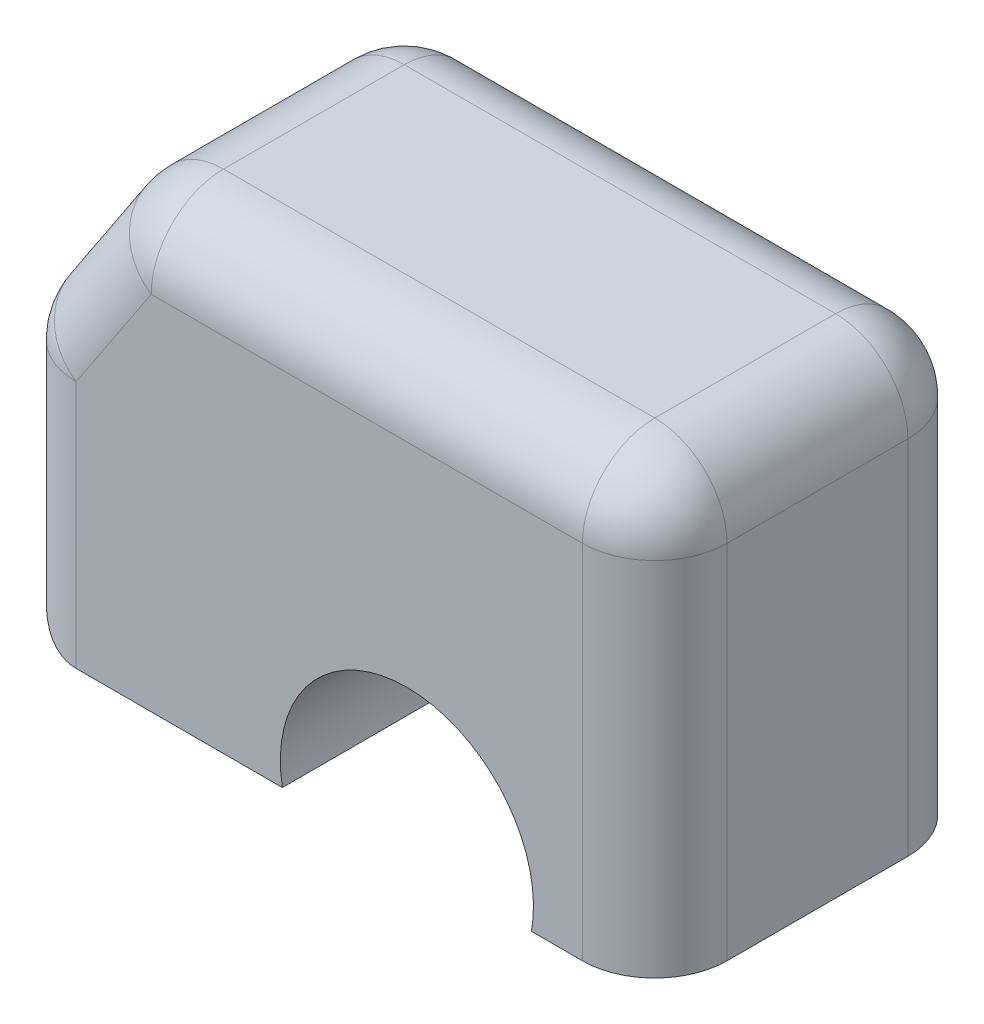
ISO-10303-21;
HEADER;
FILE_DESCRIPTION(('STEP AP214'),'2;1');
FILE_NAME('part.step','',(''),(''),'','','');
FILE_SCHEMA(('AUTOMOTIVE_DESIGN { 1 0 10303 214 1 1 1 1 }'));
ENDSEC;
DATA;
#1=APPLICATION_CONTEXT('core data for automotive mechanical design processes');
#2=APPLICATION_PROTOCOL_DEFINITION('international standard','automotive_design',2000,#1);
#3=PRODUCT_CONTEXT('',#1,'mechanical');
#4=PRODUCT('Part','Part','',(#3));
#5=PRODUCT_RELATED_PRODUCT_CATEGORY('part','',(#4));
#6=PRODUCT_DEFINITION_FORMATION('','',#4);
#7=PRODUCT_DEFINITION_CONTEXT('part definition',#1,'design');
#8=PRODUCT_DEFINITION('design','',#6,#7);
#9=PRODUCT_DEFINITION_SHAPE('','',#8);
#10=(LENGTH_UNIT() NAMED_UNIT(*) SI_UNIT(.MILLI.,.METRE.));
#11=(NAMED_UNIT(*) PLANE_ANGLE_UNIT() SI_UNIT($,.RADIAN.));
#12=(NAMED_UNIT(*) SI_UNIT($,.STERADIAN.) SOLID_ANGLE_UNIT());
#13=UNCERTAINTY_MEASURE_WITH_UNIT(LENGTH_MEASURE(1.E-05),#10,'distance_accuracy_value','');
#14=(GEOMETRIC_REPRESENTATION_CONTEXT(3) GLOBAL_UNCERTAINTY_ASSIGNED_CONTEXT((#13)) GLOBAL_UNIT_ASSIGNED_CONTEXT((#10,
#11,#12)) REPRESENTATION_CONTEXT('',''));
#15=CARTESIAN_POINT('',(0.,0.,0.));
#16=DIRECTION('',(0.,0.,1.));
#17=DIRECTION('',(1.,0.,0.));
#18=AXIS2_PLACEMENT_3D('',#15,#16,#17);
#19=CARTESIAN_POINT('',(58.0757632885705,-34.5077170209713,45.));
#20=DIRECTION('',(0.,1.,0.));
#21=DIRECTION('',(0.,0.,1.));
#22=AXIS2_PLACEMENT_3D('',#19,#20,#21);
#23=PLANE('',#22);
#24=DIRECTION('',(1.,0.,0.));
#25=VECTOR('',#24,1.);
#26=CARTESIAN_POINT('',(58.0757632885705,-34.5077170209713,0.));
#27=LINE('',#26,#25);
#28=CARTESIAN_POINT('',(58.0757632885705,-34.5077170209713,0.));
#29=VERTEX_POINT('',#28);
#30=CARTESIAN_POINT('',(65.1273648648649,-34.5077170209713,0.));
#31=VERTEX_POINT('',#30);
#32=EDGE_CURVE('E185',#29,#31,#27,.T.);
#33=ORIENTED_EDGE('',*,*,#32,.T.);
#34=CARTESIAN_POINT('',(65.1273648648649,-34.5077170209713,10.));
#35=DIRECTION('',(0.,1.,0.));
#36=DIRECTION('',(0.,0.,1.));
#37=AXIS2_PLACEMENT_3D('',#34,#35,#36);
#38=CIRCLE('',#37,10.);
#39=CARTESIAN_POINT('',(75.1273648648649,-34.5077170209713,10.));
#40=VERTEX_POINT('',#39);
#41=EDGE_CURVE('E303',#31,#40,#38,.F.);
#42=ORIENTED_EDGE('',*,*,#41,.T.);
#43=DIRECTION('',(0.,0.,-1.));
#44=VECTOR('',#43,1.);
#45=CARTESIAN_POINT('',(75.1273648648649,-34.5077170209713,45.));
#46=LINE('',#45,#44);
#47=CARTESIAN_POINT('',(75.1273648648649,-34.5077170209713,35.));
#48=VERTEX_POINT('',#47);
#49=EDGE_CURVE('E173',#48,#40,#46,.T.);
#50=ORIENTED_EDGE('',*,*,#49,.F.);
#51=CARTESIAN_POINT('',(65.1273648648649,-34.5077170209713,35.));
#52=DIRECTION('',(0.,1.,0.));
#53=DIRECTION('',(0.,0.,1.));
#54=AXIS2_PLACEMENT_3D('',#51,#52,#53);
#55=CIRCLE('',#54,10.);
#56=CARTESIAN_POINT('',(65.1273648648649,-34.5077170209713,45.));
#57=VERTEX_POINT('',#56);
#58=EDGE_CURVE('E300',#48,#57,#55,.F.);
#59=ORIENTED_EDGE('',*,*,#58,.T.);
#60=DIRECTION('',(1.,0.,0.));
#61=VECTOR('',#60,1.);
#62=CARTESIAN_POINT('',(58.0757632885705,-34.5077170209713,45.));
#63=LINE('',#62,#61);
#64=CARTESIAN_POINT('',(58.0757632885705,-34.5077170209713,45.));
#65=VERTEX_POINT('',#64);
#66=EDGE_CURVE('E163',#65,#57,#63,.T.);
#67=ORIENTED_EDGE('',*,*,#66,.F.);
#68=DIRECTION('',(0.,0.,-1.));
#69=VECTOR('',#68,1.);
#70=CARTESIAN_POINT('',(58.0757632885705,-34.5077170209713,45.));
#71=LINE('',#70,#69);
#72=EDGE_CURVE('E174',#65,#29,#71,.T.);
#73=ORIENTED_EDGE('',*,*,#72,.T.);
#74=EDGE_LOOP('',(#33,#42,#50,#59,#67,#73));
#75=FACE_BOUND('',#74,.T.);
#76=ADVANCED_FACE('F43',(#75),#23,.F.);
#77=CARTESIAN_POINT('',(75.1273648648649,25.4922829790286,45.));
#78=DIRECTION('',(-1.,0.,0.));
#79=DIRECTION('',(0.,0.,1.));
#80=AXIS2_PLACEMENT_3D('',#77,#78,#79);
#81=PLANE('',#80);
#82=ORIENTED_EDGE('',*,*,#49,.T.);
#83=DIRECTION('',(0.,1.,0.));
#84=VECTOR('',#83,1.);
#85=CARTESIAN_POINT('',(75.1273648648649,25.4922829790286,10.));
#86=LINE('',#85,#84);
#87=CARTESIAN_POINT('',(75.1273648648649,15.4922829790286,10.));
#88=VERTEX_POINT('',#87);
#89=EDGE_CURVE('E291',#40,#88,#86,.T.);
#90=ORIENTED_EDGE('',*,*,#89,.T.);
#91=DIRECTION('',(0.,0.,-1.));
#92=VECTOR('',#91,1.);
#93=CARTESIAN_POINT('',(75.1273648648649,15.4922829790286,45.));
#94=LINE('',#93,#92);
#95=CARTESIAN_POINT('',(75.1273648648649,15.4922829790286,35.));
#96=VERTEX_POINT('',#95);
#97=EDGE_CURVE('E285',#88,#96,#94,.F.);
#98=ORIENTED_EDGE('',*,*,#97,.T.);
#99=DIRECTION('',(0.,1.,0.));
#100=VECTOR('',#99,1.);
#101=CARTESIAN_POINT('',(75.1273648648649,-34.5077170209713,35.));
#102=LINE('',#101,#100);
#103=EDGE_CURVE('E288',#96,#48,#102,.F.);
#104=ORIENTED_EDGE('',*,*,#103,.T.);
#105=EDGE_LOOP('',(#82,#90,#98,#104));
#106=FACE_BOUND('',#105,.T.);
#107=ADVANCED_FACE('F412',(#106),#81,.F.);
#108=CARTESIAN_POINT('',(0.127364864864879,25.4922829790286,45.));
#109=DIRECTION('',(0.,-1.,0.));
#110=DIRECTION('',(1.,0.,0.));
#111=AXIS2_PLACEMENT_3D('',#108,#109,#110);
#112=PLANE('',#111);
#113=DIRECTION('',(0.,0.,-1.));
#114=VECTOR('',#113,1.);
#115=CARTESIAN_POINT('',(65.1273648648649,25.4922829790286,45.));
#116=LINE('',#115,#114);
#117=CARTESIAN_POINT('',(65.1273648648649,25.4922829790286,35.));
#118=VERTEX_POINT('',#117);
#119=CARTESIAN_POINT('',(65.1273648648649,25.4922829790286,10.));
#120=VERTEX_POINT('',#119);
#121=EDGE_CURVE('E53',#118,#120,#116,.T.);
#122=ORIENTED_EDGE('',*,*,#121,.T.);
#123=DIRECTION('',(-1.,0.,0.));
#124=VECTOR('',#123,1.);
#125=CARTESIAN_POINT('',(0.127364864864879,25.4922829790286,10.));
#126=LINE('',#125,#124);
#127=CARTESIAN_POINT('',(5.49799733045643,25.4922829790286,10.));
#128=VERTEX_POINT('',#127);
#129=EDGE_CURVE('E11',#120,#128,#126,.T.);
#130=ORIENTED_EDGE('',*,*,#129,.T.);
#131=DIRECTION('',(0.,0.,-1.));
#132=VECTOR('',#131,1.);
#133=CARTESIAN_POINT('',(5.49799733045643,25.4922829790286,45.));
#134=LINE('',#133,#132);
#135=CARTESIAN_POINT('',(5.49799733045643,25.4922829790286,35.));
#136=VERTEX_POINT('',#135);
#137=EDGE_CURVE('E241',#128,#136,#134,.F.);
#138=ORIENTED_EDGE('',*,*,#137,.T.);
#139=DIRECTION('',(-1.,0.,0.));
#140=VECTOR('',#139,1.);
#141=CARTESIAN_POINT('',(75.1273648648649,25.4922829790286,35.));
#142=LINE('',#141,#140);
#143=EDGE_CURVE('E64',#136,#118,#142,.F.);
#144=ORIENTED_EDGE('',*,*,#143,.T.);
#145=EDGE_LOOP('',(#122,#130,#138,#144));
#146=FACE_BOUND('',#145,.T.);
#147=ADVANCED_FACE('F418',(#146),#112,.F.);
#148=CARTESIAN_POINT('',(-14.8726351351351,2.84931836452923,45.));
#149=DIRECTION('',(0.833666334329219,-0.552268451938079,0.));
#150=DIRECTION('',(0.552268451938079,0.833666334329219,0.));
#151=AXIS2_PLACEMENT_3D('',#148,#149,#150);
#152=PLANE('',#151);
#153=DIRECTION('',(-0.552268451938079,-0.833666334329219,0.));
#154=VECTOR('',#153,1.);
#155=CARTESIAN_POINT('',(-14.8726351351351,2.84931836452923,10.));
#156=LINE('',#155,#154);
#157=CARTESIAN_POINT('',(-2.83866601283576,21.0149674984094,10.));
#158=VERTEX_POINT('',#157);
#159=CARTESIAN_POINT('',(-13.2092984784273,5.3601765685182,10.));
#160=VERTEX_POINT('',#159);
#161=EDGE_CURVE('E230',#158,#160,#156,.T.);
#162=ORIENTED_EDGE('',*,*,#161,.T.);
#163=DIRECTION('',(0.,0.,-1.));
#164=VECTOR('',#163,1.);
#165=CARTESIAN_POINT('',(-13.2092984784273,5.3601765685182,45.));
#166=LINE('',#165,#164);
#167=CARTESIAN_POINT('',(-13.2092984784273,5.3601765685182,35.));
#168=VERTEX_POINT('',#167);
#169=EDGE_CURVE('E237',#160,#168,#166,.F.);
#170=ORIENTED_EDGE('',*,*,#169,.T.);
#171=DIRECTION('',(-0.552268451938079,-0.833666334329219,0.));
#172=VECTOR('',#171,1.);
#173=CARTESIAN_POINT('',(0.127364864864878,25.4922829790286,35.));
#174=LINE('',#173,#172);
#175=CARTESIAN_POINT('',(-2.83866601283576,21.0149674984094,35.));
#176=VERTEX_POINT('',#175);
#177=EDGE_CURVE('E233',#168,#176,#174,.F.);
#178=ORIENTED_EDGE('',*,*,#177,.T.);
#179=DIRECTION('',(0.,0.,-1.));
#180=VECTOR('',#179,1.);
#181=CARTESIAN_POINT('',(-2.83866601283576,21.0149674984094,45.));
#182=LINE('',#181,#180);
#183=EDGE_CURVE('E226',#176,#158,#182,.T.);
#184=ORIENTED_EDGE('',*,*,#183,.T.);
#185=EDGE_LOOP('',(#162,#170,#178,#184));
#186=FACE_BOUND('',#185,.T.);
#187=ADVANCED_FACE('F360',(#186),#152,.F.);
#188=CARTESIAN_POINT('',(-14.8726351351351,2.84931836452923,45.));
#189=DIRECTION('',(1.,0.,0.));
#190=DIRECTION('',(0.,0.,-1.));
#191=AXIS2_PLACEMENT_3D('',#188,#189,#190);
#192=PLANE('',#191);
#193=DIRECTION('',(0.,-1.,0.));
#194=VECTOR('',#193,1.);
#195=CARTESIAN_POINT('',(-14.8726351351351,2.84931836452923,10.));
#196=LINE('',#195,#194);
#197=CARTESIAN_POINT('',(-14.8726351351351,-0.162507950862588,10.));
#198=VERTEX_POINT('',#197);
#199=CARTESIAN_POINT('',(-14.8726351351351,-24.5077170209714,10.));
#200=VERTEX_POINT('',#199);
#201=EDGE_CURVE('E204',#198,#200,#196,.T.);
#202=ORIENTED_EDGE('',*,*,#201,.T.);
#203=DIRECTION('',(0.,0.,-1.));
#204=VECTOR('',#203,1.);
#205=CARTESIAN_POINT('',(-14.8726351351351,-24.5077170209714,45.));
#206=LINE('',#205,#204);
#207=CARTESIAN_POINT('',(-14.8726351351351,-24.5077170209714,35.));
#208=VERTEX_POINT('',#207);
#209=EDGE_CURVE('E210',#200,#208,#206,.F.);
#210=ORIENTED_EDGE('',*,*,#209,.T.);
#211=DIRECTION('',(0.,-1.,0.));
#212=VECTOR('',#211,1.);
#213=CARTESIAN_POINT('',(-14.8726351351351,2.84931836452923,35.));
#214=LINE('',#213,#212);
#215=CARTESIAN_POINT('',(-14.8726351351351,-0.162507950862588,35.));
#216=VERTEX_POINT('',#215);
#217=EDGE_CURVE('E207',#208,#216,#214,.F.);
#218=ORIENTED_EDGE('',*,*,#217,.T.);
#219=DIRECTION('',(0.,0.,-1.));
#220=VECTOR('',#219,1.);
#221=CARTESIAN_POINT('',(-14.8726351351351,-0.162507950862588,45.));
#222=LINE('',#221,#220);
#223=EDGE_CURVE('E201',#216,#198,#222,.T.);
#224=ORIENTED_EDGE('',*,*,#223,.T.);
#225=EDGE_LOOP('',(#202,#210,#218,#224));
#226=FACE_BOUND('',#225,.T.);
#227=ADVANCED_FACE('F391',(#226),#192,.F.);
#228=CARTESIAN_POINT('',(-14.8726351351351,-34.5077170209713,45.));
#229=DIRECTION('',(0.,1.,0.));
#230=DIRECTION('',(0.,0.,1.));
#231=AXIS2_PLACEMENT_3D('',#228,#229,#230);
#232=PLANE('',#231);
#233=DIRECTION('',(1.,0.,0.));
#234=VECTOR('',#233,1.);
#235=CARTESIAN_POINT('',(-14.8726351351351,-34.5077170209713,45.));
#236=LINE('',#235,#234);
#237=CARTESIAN_POINT('',(-4.87263513513513,-34.5077170209713,45.));
#238=VERTEX_POINT('',#237);
#239=CARTESIAN_POINT('',(23.6375119916014,-34.5077170209713,45.));
#240=VERTEX_POINT('',#239);
#241=EDGE_CURVE('E150',#238,#240,#236,.T.);
#242=ORIENTED_EDGE('',*,*,#241,.F.);
#243=DIRECTION('',(0.,0.,-1.));
#244=VECTOR('',#243,1.);
#245=CARTESIAN_POINT('',(-4.87263513513512,-34.5077170209713,45.));
#246=LINE('',#245,#244);
#247=CARTESIAN_POINT('',(-4.87263513513512,-34.5077170209713,0.));
#248=VERTEX_POINT('',#247);
#249=EDGE_CURVE('E198',#238,#248,#246,.T.);
#250=ORIENTED_EDGE('',*,*,#249,.T.);
#251=DIRECTION('',(1.,0.,0.));
#252=VECTOR('',#251,1.);
#253=CARTESIAN_POINT('',(-14.8726351351351,-34.5077170209713,0.));
#254=LINE('',#253,#252);
#255=CARTESIAN_POINT('',(23.6375119916014,-34.5077170209713,0.));
#256=VERTEX_POINT('',#255);
#257=EDGE_CURVE('E169',#248,#256,#254,.T.);
#258=ORIENTED_EDGE('',*,*,#257,.T.);
#259=DIRECTION('',(0.,0.,-1.));
#260=VECTOR('',#259,1.);
#261=CARTESIAN_POINT('',(23.6375119916014,-34.5077170209713,45.));
#262=LINE('',#261,#260);
#263=EDGE_CURVE('E166',#240,#256,#262,.T.);
#264=ORIENTED_EDGE('',*,*,#263,.F.);
#265=EDGE_LOOP('',(#242,#250,#258,#264));
#266=FACE_BOUND('',#265,.T.);
#267=ADVANCED_FACE('F167',(#266),#232,.F.);
#268=CARTESIAN_POINT('',(40.856637640086,-31.3849439101448,45.));
#269=DIRECTION('',(0.,0.,-1.));
#270=DIRECTION('',(-1.,0.,0.));
#271=AXIS2_PLACEMENT_3D('',#268,#269,#270);
#272=CYLINDRICAL_SURFACE('',#271,17.5);
#273=CARTESIAN_POINT('',(40.856637640086,-31.3849439101448,0.));
#274=DIRECTION('',(0.,0.,-1.));
#275=DIRECTION('',(1.,0.,0.));
#276=AXIS2_PLACEMENT_3D('',#273,#274,#275);
#277=CIRCLE('',#276,17.5);
#278=EDGE_CURVE('E192',#256,#29,#277,.T.);
#279=ORIENTED_EDGE('',*,*,#278,.T.);
#280=ORIENTED_EDGE('',*,*,#72,.F.);
#281=CARTESIAN_POINT('',(40.856637640086,-31.3849439101448,45.));
#282=DIRECTION('',(0.,0.,-1.));
#283=DIRECTION('',(1.,0.,0.));
#284=AXIS2_PLACEMENT_3D('',#281,#282,#283);
#285=CIRCLE('',#284,17.5);
#286=EDGE_CURVE('E155',#240,#65,#285,.T.);
#287=ORIENTED_EDGE('',*,*,#286,.F.);
#288=ORIENTED_EDGE('',*,*,#263,.T.);
#289=EDGE_LOOP('',(#279,#280,#287,#288));
#290=FACE_BOUND('',#289,.T.);
#291=ADVANCED_FACE('F176',(#290),#272,.F.);
#292=CARTESIAN_POINT('',(40.856637640086,-31.3849439101448,45.));
#293=DIRECTION('',(0.,0.,1.));
#294=DIRECTION('',(1.,0.,0.));
#295=AXIS2_PLACEMENT_3D('',#292,#293,#294);
#296=PLANE('',#295);
#297=ORIENTED_EDGE('',*,*,#66,.T.);
#298=DIRECTION('',(0.,1.,0.));
#299=VECTOR('',#298,1.);
#300=CARTESIAN_POINT('',(65.1273648648649,25.4922829790286,45.));
#301=LINE('',#300,#299);
#302=CARTESIAN_POINT('',(65.1273648648649,15.4922829790286,45.));
#303=VERTEX_POINT('',#302);
#304=EDGE_CURVE('E309',#57,#303,#301,.T.);
#305=ORIENTED_EDGE('',*,*,#304,.T.);
#306=DIRECTION('',(-1.,0.,0.));
#307=VECTOR('',#306,1.);
#308=CARTESIAN_POINT('',(12.1225715659321,15.4922829790286,45.));
#309=LINE('',#308,#307);
#310=CARTESIAN_POINT('',(5.49799733045644,15.4922829790286,45.));
#311=VERTEX_POINT('',#310);
#312=EDGE_CURVE('E306',#303,#311,#309,.T.);
#313=ORIENTED_EDGE('',*,*,#312,.T.);
#314=DIRECTION('',(-0.552268451938079,-0.833666334329219,0.));
#315=VECTOR('',#314,1.);
#316=CARTESIAN_POINT('',(-6.53597179184292,-2.67336615485156,45.));
#317=LINE('',#316,#315);
#318=CARTESIAN_POINT('',(-4.87263513513513,-0.162507950862605,45.));
#319=VERTEX_POINT('',#318);
#320=EDGE_CURVE('E214',#311,#319,#317,.T.);
#321=ORIENTED_EDGE('',*,*,#320,.T.);
#322=DIRECTION('',(0.,-1.,0.));
#323=VECTOR('',#322,1.);
#324=CARTESIAN_POINT('',(-4.87263513513513,-34.5077170209713,45.));
#325=LINE('',#324,#323);
#326=EDGE_CURVE('E158',#319,#238,#325,.T.);
#327=ORIENTED_EDGE('',*,*,#326,.T.);
#328=ORIENTED_EDGE('',*,*,#241,.T.);
#329=ORIENTED_EDGE('',*,*,#286,.T.);
#330=EDGE_LOOP('',(#297,#305,#313,#321,#327,#328,#329));
#331=FACE_BOUND('',#330,.T.);
#332=ADVANCED_FACE('F153',(#331),#296,.T.);
#333=CARTESIAN_POINT('',(40.856637640086,-31.3849439101448,0.));
#334=DIRECTION('',(0.,0.,1.));
#335=DIRECTION('',(1.,0.,0.));
#336=AXIS2_PLACEMENT_3D('',#333,#334,#335);
#337=PLANE('',#336);
#338=DIRECTION('',(-1.,0.,0.));
#339=VECTOR('',#338,1.);
#340=CARTESIAN_POINT('',(40.856637640086,15.4922829790286,0.));
#341=LINE('',#340,#339);
#342=CARTESIAN_POINT('',(5.49799733045644,15.4922829790286,0.));
#343=VERTEX_POINT('',#342);
#344=CARTESIAN_POINT('',(65.1273648648649,15.4922829790286,0.));
#345=VERTEX_POINT('',#344);
#346=EDGE_CURVE('E294',#343,#345,#341,.F.);
#347=ORIENTED_EDGE('',*,*,#346,.T.);
#348=DIRECTION('',(0.,1.,0.));
#349=VECTOR('',#348,1.);
#350=CARTESIAN_POINT('',(65.1273648648649,-31.3849439101448,0.));
#351=LINE('',#350,#349);
#352=EDGE_CURVE('E297',#345,#31,#351,.F.);
#353=ORIENTED_EDGE('',*,*,#352,.T.);
#354=ORIENTED_EDGE('',*,*,#32,.F.);
#355=ORIENTED_EDGE('',*,*,#278,.F.);
#356=ORIENTED_EDGE('',*,*,#257,.F.);
#357=DIRECTION('',(0.,-1.,0.));
#358=VECTOR('',#357,1.);
#359=CARTESIAN_POINT('',(-4.87263513513513,-31.3849439101448,0.));
#360=LINE('',#359,#358);
#361=CARTESIAN_POINT('',(-4.87263513513512,-0.162507950862584,0.));
#362=VERTEX_POINT('',#361);
#363=EDGE_CURVE('E223',#248,#362,#360,.F.);
#364=ORIENTED_EDGE('',*,*,#363,.T.);
#365=DIRECTION('',(-0.552268451938079,-0.833666334329219,0.));
#366=VECTOR('',#365,1.);
#367=CARTESIAN_POINT('',(-5.30023398272832,-0.807981655879496,0.));
#368=LINE('',#367,#366);
#369=EDGE_CURVE('E219',#362,#343,#368,.F.);
#370=ORIENTED_EDGE('',*,*,#369,.T.);
#371=EDGE_LOOP('',(#347,#353,#354,#355,#356,#364,#370));
#372=FACE_BOUND('',#371,.T.);
#373=ADVANCED_FACE('F377',(#372),#337,.F.);
#374=CARTESIAN_POINT('',(5.49799733045643,15.4922829790286,45.));
#375=DIRECTION('',(0.,0.,-1.));
#376=DIRECTION('',(-1.,0.,0.));
#377=AXIS2_PLACEMENT_3D('',#374,#375,#376);
#378=CYLINDRICAL_SURFACE('',#377,10.);
#379=ORIENTED_EDGE('',*,*,#137,.F.);
#380=CARTESIAN_POINT('',(5.49799733045643,15.4922829790286,10.));
#381=DIRECTION('',(0.,0.,-1.));
#382=DIRECTION('',(-1.,0.,0.));
#383=AXIS2_PLACEMENT_3D('',#380,#381,#382);
#384=CIRCLE('',#383,10.);
#385=EDGE_CURVE('E279',#128,#158,#384,.F.);
#386=ORIENTED_EDGE('',*,*,#385,.T.);
#387=ORIENTED_EDGE('',*,*,#183,.F.);
#388=CARTESIAN_POINT('',(5.49799733045643,15.4922829790286,35.));
#389=DIRECTION('',(0.,0.,-1.));
#390=DIRECTION('',(-1.,0.,0.));
#391=AXIS2_PLACEMENT_3D('',#388,#389,#390);
#392=CIRCLE('',#391,10.);
#393=EDGE_CURVE('E276',#176,#136,#392,.T.);
#394=ORIENTED_EDGE('',*,*,#393,.T.);
#395=EDGE_LOOP('',(#379,#386,#387,#394));
#396=FACE_BOUND('',#395,.T.);
#397=ADVANCED_FACE('F365',(#396),#378,.T.);
#398=CARTESIAN_POINT('',(-5.30023398272832,-0.807981655879496,35.));
#399=DIRECTION('',(0.552268451938079,0.833666334329219,0.));
#400=DIRECTION('',(-0.833666334329219,0.552268451938079,0.));
#401=AXIS2_PLACEMENT_3D('',#398,#399,#400);
#402=CYLINDRICAL_SURFACE('',#401,10.);
#403=ORIENTED_EDGE('',*,*,#320,.F.);
#404=CARTESIAN_POINT('',(5.49799733045644,15.4922829790286,35.));
#405=DIRECTION('',(0.552268451938079,0.833666334329219,0.));
#406=DIRECTION('',(-0.833666334329219,0.552268451938079,0.));
#407=AXIS2_PLACEMENT_3D('',#404,#405,#406);
#408=CIRCLE('',#407,10.);
#409=EDGE_CURVE('E282',#311,#176,#408,.F.);
#410=ORIENTED_EDGE('',*,*,#409,.T.);
#411=ORIENTED_EDGE('',*,*,#177,.F.);
#412=CARTESIAN_POINT('',(-4.87263513513513,-0.162507950862605,35.));
#413=DIRECTION('',(-0.55226845193808,-0.833666334329218,0.));
#414=DIRECTION('',(0.833666334329219,-0.55226845193808,0.));
#415=AXIS2_PLACEMENT_3D('',#412,#413,#414);
#416=CIRCLE('',#415,10.);
#417=EDGE_CURVE('E267',#319,#168,#416,.T.);
#418=ORIENTED_EDGE('',*,*,#417,.F.);
#419=EDGE_LOOP('',(#403,#410,#411,#418));
#420=FACE_BOUND('',#419,.T.);
#421=ADVANCED_FACE('F356',(#420),#402,.T.);
#422=CARTESIAN_POINT('',(-6.53597179184293,-2.67336615485156,10.));
#423=DIRECTION('',(-0.552268451938079,-0.833666334329219,0.));
#424=DIRECTION('',(0.833666334329219,-0.552268451938079,0.));
#425=AXIS2_PLACEMENT_3D('',#422,#423,#424);
#426=CYLINDRICAL_SURFACE('',#425,10.);
#427=ORIENTED_EDGE('',*,*,#161,.F.);
#428=CARTESIAN_POINT('',(5.49799733045644,15.4922829790286,10.));
#429=DIRECTION('',(-0.552268451938079,-0.833666334329219,0.));
#430=DIRECTION('',(0.833666334329219,-0.552268451938079,0.));
#431=AXIS2_PLACEMENT_3D('',#428,#429,#430);
#432=CIRCLE('',#431,10.);
#433=EDGE_CURVE('E244',#158,#343,#432,.T.);
#434=ORIENTED_EDGE('',*,*,#433,.T.);
#435=ORIENTED_EDGE('',*,*,#369,.F.);
#436=CARTESIAN_POINT('',(-4.87263513513512,-0.162507950862588,10.));
#437=DIRECTION('',(-0.552268451938079,-0.833666334329219,0.));
#438=DIRECTION('',(0.833666334329219,-0.552268451938079,0.));
#439=AXIS2_PLACEMENT_3D('',#436,#437,#438);
#440=CIRCLE('',#439,10.);
#441=EDGE_CURVE('E263',#160,#362,#440,.T.);
#442=ORIENTED_EDGE('',*,*,#441,.F.);
#443=EDGE_LOOP('',(#427,#434,#435,#442));
#444=FACE_BOUND('',#443,.T.);
#445=ADVANCED_FACE('F374',(#444),#426,.T.);
#446=CARTESIAN_POINT('',(-4.87263513513512,-0.162507950862588,45.));
#447=DIRECTION('',(0.,0.,-1.));
#448=DIRECTION('',(-1.,0.,0.));
#449=AXIS2_PLACEMENT_3D('',#446,#447,#448);
#450=CYLINDRICAL_SURFACE('',#449,10.);
#451=CARTESIAN_POINT('',(-4.87263513513512,-0.162507950862588,35.));
#452=DIRECTION('',(0.,0.,1.));
#453=DIRECTION('',(1.,0.,0.));
#454=AXIS2_PLACEMENT_3D('',#451,#452,#453);
#455=CIRCLE('',#454,10.);
#456=EDGE_CURVE('E189',#168,#216,#455,.T.);
#457=ORIENTED_EDGE('',*,*,#456,.F.);
#458=ORIENTED_EDGE('',*,*,#169,.F.);
#459=CARTESIAN_POINT('',(-4.87263513513512,-0.162507950862588,10.));
#460=DIRECTION('',(0.,0.,-1.));
#461=DIRECTION('',(-1.,0.,0.));
#462=AXIS2_PLACEMENT_3D('',#459,#460,#461);
#463=CIRCLE('',#462,10.);
#464=EDGE_CURVE('E259',#198,#160,#463,.T.);
#465=ORIENTED_EDGE('',*,*,#464,.F.);
#466=ORIENTED_EDGE('',*,*,#223,.F.);
#467=EDGE_LOOP('',(#457,#458,#465,#466));
#468=FACE_BOUND('',#467,.T.);
#469=ADVANCED_FACE('F396',(#468),#450,.T.);
#470=CARTESIAN_POINT('',(-4.87263513513512,-0.162507950862587,35.));
#471=DIRECTION('',(0.,0.,1.));
#472=DIRECTION('',(1.,0.,0.));
#473=AXIS2_PLACEMENT_3D('',#470,#471,#472);
#474=SPHERICAL_SURFACE('',#473,10.);
#475=ORIENTED_EDGE('',*,*,#417,.T.);
#476=ORIENTED_EDGE('',*,*,#456,.T.);
#477=CARTESIAN_POINT('',(-4.87263513513512,-0.162507950862588,35.));
#478=DIRECTION('',(0.,1.,0.));
#479=DIRECTION('',(0.,0.,1.));
#480=AXIS2_PLACEMENT_3D('',#477,#478,#479);
#481=CIRCLE('',#480,10.);
#482=EDGE_CURVE('E255',#319,#216,#481,.F.);
#483=ORIENTED_EDGE('',*,*,#482,.F.);
#484=EDGE_LOOP('',(#475,#476,#483));
#485=FACE_BOUND('',#484,.T.);
#486=ADVANCED_FACE('F401',(#485),#474,.T.);
#487=CARTESIAN_POINT('',(-4.87263513513512,-0.162507950862587,10.));
#488=DIRECTION('',(0.,0.,1.));
#489=DIRECTION('',(1.,0.,0.));
#490=AXIS2_PLACEMENT_3D('',#487,#488,#489);
#491=SPHERICAL_SURFACE('',#490,10.);
#492=ORIENTED_EDGE('',*,*,#464,.T.);
#493=ORIENTED_EDGE('',*,*,#441,.T.);
#494=CARTESIAN_POINT('',(-4.87263513513512,-0.162507950862584,10.));
#495=DIRECTION('',(0.,1.,0.));
#496=DIRECTION('',(-1.,0.,0.));
#497=AXIS2_PLACEMENT_3D('',#494,#495,#496);
#498=CIRCLE('',#497,10.);
#499=EDGE_CURVE('E251',#198,#362,#498,.F.);
#500=ORIENTED_EDGE('',*,*,#499,.F.);
#501=EDGE_LOOP('',(#492,#493,#500));
#502=FACE_BOUND('',#501,.T.);
#503=ADVANCED_FACE('F398',(#502),#491,.T.);
#504=CARTESIAN_POINT('',(-4.87263513513513,-31.3849439101448,35.));
#505=DIRECTION('',(0.,1.,0.));
#506=DIRECTION('',(0.,0.,1.));
#507=AXIS2_PLACEMENT_3D('',#504,#505,#506);
#508=CYLINDRICAL_SURFACE('',#507,10.);
#509=ORIENTED_EDGE('',*,*,#482,.T.);
#510=ORIENTED_EDGE('',*,*,#217,.F.);
#511=CARTESIAN_POINT('',(-4.87263513513512,-24.5077170209714,35.));
#512=DIRECTION('',(0.,0.707106781186547,0.707106781186547));
#513=DIRECTION('',(0.,0.707106781186547,-0.707106781186547));
#514=AXIS2_PLACEMENT_3D('',#511,#512,#513);
#515=ELLIPSE('',#514,14.1421356237309,10.);
#516=EDGE_CURVE('E248',#238,#208,#515,.F.);
#517=ORIENTED_EDGE('',*,*,#516,.F.);
#518=ORIENTED_EDGE('',*,*,#326,.F.);
#519=EDGE_LOOP('',(#509,#510,#517,#518));
#520=FACE_BOUND('',#519,.T.);
#521=ADVANCED_FACE('F400',(#520),#508,.T.);
#522=CARTESIAN_POINT('',(-4.87263513513512,2.84931836452923,10.));
#523=DIRECTION('',(0.,-1.,0.));
#524=DIRECTION('',(0.,0.,-1.));
#525=AXIS2_PLACEMENT_3D('',#522,#523,#524);
#526=CYLINDRICAL_SURFACE('',#525,10.);
#527=ORIENTED_EDGE('',*,*,#499,.T.);
#528=ORIENTED_EDGE('',*,*,#363,.F.);
#529=CARTESIAN_POINT('',(-4.87263513513512,-24.5077170209714,10.));
#530=DIRECTION('',(0.,-0.707106781186547,0.707106781186547));
#531=DIRECTION('',(0.,-0.707106781186547,-0.707106781186547));
#532=AXIS2_PLACEMENT_3D('',#529,#530,#531);
#533=ELLIPSE('',#532,14.1421356237309,10.);
#534=EDGE_CURVE('E245',#200,#248,#533,.T.);
#535=ORIENTED_EDGE('',*,*,#534,.F.);
#536=ORIENTED_EDGE('',*,*,#201,.F.);
#537=EDGE_LOOP('',(#527,#528,#535,#536));
#538=FACE_BOUND('',#537,.T.);
#539=ADVANCED_FACE('F382',(#538),#526,.T.);
#540=CARTESIAN_POINT('',(-4.87263513513512,-24.5077170209714,45.));
#541=DIRECTION('',(0.,0.,-1.));
#542=DIRECTION('',(-1.,0.,0.));
#543=AXIS2_PLACEMENT_3D('',#540,#541,#542);
#544=CYLINDRICAL_SURFACE('',#543,10.);
#545=ORIENTED_EDGE('',*,*,#516,.T.);
#546=ORIENTED_EDGE('',*,*,#209,.F.);
#547=ORIENTED_EDGE('',*,*,#534,.T.);
#548=ORIENTED_EDGE('',*,*,#249,.F.);
#549=EDGE_LOOP('',(#545,#546,#547,#548));
#550=FACE_BOUND('',#549,.T.);
#551=ADVANCED_FACE('F387',(#550),#544,.T.);
#552=CARTESIAN_POINT('',(5.49799733045644,15.4922829790286,35.));
#553=DIRECTION('',(0.,0.,1.));
#554=DIRECTION('',(1.,0.,0.));
#555=AXIS2_PLACEMENT_3D('',#552,#553,#554);
#556=SPHERICAL_SURFACE('',#555,10.);
#557=CARTESIAN_POINT('',(5.49799733045643,15.4922829790286,35.));
#558=DIRECTION('',(1.,0.,0.));
#559=DIRECTION('',(0.,0.,-1.));
#560=AXIS2_PLACEMENT_3D('',#557,#558,#559);
#561=CIRCLE('',#560,10.);
#562=EDGE_CURVE('E47',#136,#311,#561,.T.);
#563=ORIENTED_EDGE('',*,*,#562,.F.);
#564=ORIENTED_EDGE('',*,*,#393,.F.);
#565=ORIENTED_EDGE('',*,*,#409,.F.);
#566=EDGE_LOOP('',(#563,#564,#565));
#567=FACE_BOUND('',#566,.T.);
#568=ADVANCED_FACE('F45',(#567),#556,.T.);
#569=CARTESIAN_POINT('',(65.1273648648649,-31.3849439101448,35.));
#570=DIRECTION('',(0.,-1.,0.));
#571=DIRECTION('',(0.,0.,-1.));
#572=AXIS2_PLACEMENT_3D('',#569,#570,#571);
#573=CYLINDRICAL_SURFACE('',#572,10.);
#574=ORIENTED_EDGE('',*,*,#58,.F.);
#575=ORIENTED_EDGE('',*,*,#103,.F.);
#576=CARTESIAN_POINT('',(65.1273648648649,15.4922829790286,35.));
#577=DIRECTION('',(0.,1.,0.));
#578=DIRECTION('',(-1.,0.,0.));
#579=AXIS2_PLACEMENT_3D('',#576,#577,#578);
#580=CIRCLE('',#579,10.);
#581=EDGE_CURVE('E338',#303,#96,#580,.T.);
#582=ORIENTED_EDGE('',*,*,#581,.F.);
#583=ORIENTED_EDGE('',*,*,#304,.F.);
#584=EDGE_LOOP('',(#574,#575,#582,#583));
#585=FACE_BOUND('',#584,.T.);
#586=ADVANCED_FACE('F442',(#585),#573,.T.);
#587=CARTESIAN_POINT('',(40.856637640086,15.4922829790286,35.));
#588=DIRECTION('',(1.,0.,0.));
#589=DIRECTION('',(0.,1.,0.));
#590=AXIS2_PLACEMENT_3D('',#587,#588,#589);
#591=CYLINDRICAL_SURFACE('',#590,10.);
#592=ORIENTED_EDGE('',*,*,#562,.T.);
#593=ORIENTED_EDGE('',*,*,#312,.F.);
#594=CARTESIAN_POINT('',(65.1273648648649,15.4922829790286,35.));
#595=DIRECTION('',(1.,0.,0.));
#596=DIRECTION('',(0.,0.,-1.));
#597=AXIS2_PLACEMENT_3D('',#594,#595,#596);
#598=CIRCLE('',#597,10.);
#599=EDGE_CURVE('E335',#118,#303,#598,.T.);
#600=ORIENTED_EDGE('',*,*,#599,.F.);
#601=ORIENTED_EDGE('',*,*,#143,.F.);
#602=EDGE_LOOP('',(#592,#593,#600,#601));
#603=FACE_BOUND('',#602,.T.);
#604=ADVANCED_FACE('F349',(#603),#591,.T.);
#605=CARTESIAN_POINT('',(65.1273648648649,15.4922829790286,35.));
#606=DIRECTION('',(0.,0.,1.));
#607=DIRECTION('',(1.,0.,0.));
#608=AXIS2_PLACEMENT_3D('',#605,#606,#607);
#609=SPHERICAL_SURFACE('',#608,10.);
#610=ORIENTED_EDGE('',*,*,#599,.T.);
#611=ORIENTED_EDGE('',*,*,#581,.T.);
#612=CARTESIAN_POINT('',(65.1273648648649,15.4922829790286,35.));
#613=DIRECTION('',(0.,0.,1.));
#614=DIRECTION('',(1.,0.,0.));
#615=AXIS2_PLACEMENT_3D('',#612,#613,#614);
#616=CIRCLE('',#615,10.);
#617=EDGE_CURVE('E331',#118,#96,#616,.F.);
#618=ORIENTED_EDGE('',*,*,#617,.F.);
#619=EDGE_LOOP('',(#610,#611,#618));
#620=FACE_BOUND('',#619,.T.);
#621=ADVANCED_FACE('F457',(#620),#609,.T.);
#622=CARTESIAN_POINT('',(65.1273648648649,25.4922829790286,10.));
#623=DIRECTION('',(0.,1.,0.));
#624=DIRECTION('',(0.,0.,1.));
#625=AXIS2_PLACEMENT_3D('',#622,#623,#624);
#626=CYLINDRICAL_SURFACE('',#625,10.);
#627=ORIENTED_EDGE('',*,*,#41,.F.);
#628=ORIENTED_EDGE('',*,*,#352,.F.);
#629=CARTESIAN_POINT('',(65.1273648648649,15.4922829790286,10.));
#630=DIRECTION('',(0.,1.,0.));
#631=DIRECTION('',(0.,0.,1.));
#632=AXIS2_PLACEMENT_3D('',#629,#630,#631);
#633=CIRCLE('',#632,10.);
#634=EDGE_CURVE('E327',#88,#345,#633,.T.);
#635=ORIENTED_EDGE('',*,*,#634,.F.);
#636=ORIENTED_EDGE('',*,*,#89,.F.);
#637=EDGE_LOOP('',(#627,#628,#635,#636));
#638=FACE_BOUND('',#637,.T.);
#639=ADVANCED_FACE('F465',(#638),#626,.T.);
#640=CARTESIAN_POINT('',(65.1273648648649,15.4922829790286,45.));
#641=DIRECTION('',(0.,0.,-1.));
#642=DIRECTION('',(-1.,0.,0.));
#643=AXIS2_PLACEMENT_3D('',#640,#641,#642);
#644=CYLINDRICAL_SURFACE('',#643,10.);
#645=ORIENTED_EDGE('',*,*,#617,.T.);
#646=ORIENTED_EDGE('',*,*,#97,.F.);
#647=CARTESIAN_POINT('',(65.1273648648649,15.4922829790286,10.));
#648=DIRECTION('',(0.,0.,-1.));
#649=DIRECTION('',(-1.,0.,0.));
#650=AXIS2_PLACEMENT_3D('',#647,#648,#649);
#651=CIRCLE('',#650,10.);
#652=EDGE_CURVE('E323',#120,#88,#651,.T.);
#653=ORIENTED_EDGE('',*,*,#652,.F.);
#654=ORIENTED_EDGE('',*,*,#121,.F.);
#655=EDGE_LOOP('',(#645,#646,#653,#654));
#656=FACE_BOUND('',#655,.T.);
#657=ADVANCED_FACE('F472',(#656),#644,.T.);
#658=CARTESIAN_POINT('',(65.1273648648649,15.4922829790286,10.));
#659=DIRECTION('',(0.,0.,1.));
#660=DIRECTION('',(1.,0.,0.));
#661=AXIS2_PLACEMENT_3D('',#658,#659,#660);
#662=SPHERICAL_SURFACE('',#661,10.);
#663=ORIENTED_EDGE('',*,*,#652,.T.);
#664=ORIENTED_EDGE('',*,*,#634,.T.);
#665=CARTESIAN_POINT('',(65.1273648648649,15.4922829790286,10.));
#666=DIRECTION('',(1.,0.,0.));
#667=DIRECTION('',(0.,1.,0.));
#668=AXIS2_PLACEMENT_3D('',#665,#666,#667);
#669=CIRCLE('',#668,10.);
#670=EDGE_CURVE('E319',#120,#345,#669,.F.);
#671=ORIENTED_EDGE('',*,*,#670,.F.);
#672=EDGE_LOOP('',(#663,#664,#671));
#673=FACE_BOUND('',#672,.T.);
#674=ADVANCED_FACE('F479',(#673),#662,.T.);
#675=CARTESIAN_POINT('',(0.127364864864879,15.4922829790286,10.));
#676=DIRECTION('',(-1.,0.,0.));
#677=DIRECTION('',(0.,-1.,0.));
#678=AXIS2_PLACEMENT_3D('',#675,#676,#677);
#679=CYLINDRICAL_SURFACE('',#678,10.);
#680=CARTESIAN_POINT('',(5.49799733045643,15.4922829790286,10.));
#681=DIRECTION('',(-1.,0.,0.));
#682=DIRECTION('',(0.,0.,1.));
#683=AXIS2_PLACEMENT_3D('',#680,#681,#682);
#684=CIRCLE('',#683,10.);
#685=EDGE_CURVE('E316',#128,#343,#684,.T.);
#686=ORIENTED_EDGE('',*,*,#685,.F.);
#687=ORIENTED_EDGE('',*,*,#129,.F.);
#688=ORIENTED_EDGE('',*,*,#670,.T.);
#689=ORIENTED_EDGE('',*,*,#346,.F.);
#690=EDGE_LOOP('',(#686,#687,#688,#689));
#691=FACE_BOUND('',#690,.T.);
#692=ADVANCED_FACE('F486',(#691),#679,.T.);
#693=CARTESIAN_POINT('',(5.49799733045644,15.4922829790286,10.));
#694=DIRECTION('',(0.,0.,1.));
#695=DIRECTION('',(1.,0.,0.));
#696=AXIS2_PLACEMENT_3D('',#693,#694,#695);
#697=SPHERICAL_SURFACE('',#696,10.);
#698=ORIENTED_EDGE('',*,*,#433,.F.);
#699=ORIENTED_EDGE('',*,*,#385,.F.);
#700=ORIENTED_EDGE('',*,*,#685,.T.);
#701=EDGE_LOOP('',(#698,#699,#700));
#702=FACE_BOUND('',#701,.T.);
#703=ADVANCED_FACE('F370',(#702),#697,.T.);
#704=CLOSED_SHELL('',(#76,#107,#147,#187,#227,#267,#291,#332,#373,#397,#421,#445,#469,#486,#503,
#521,#539,#551,#568,#586,#604,#621,#639,#657,#674,#692,#703));
#705=MANIFOLD_SOLID_BREP('B2',#704);
#706=ADVANCED_BREP_SHAPE_REPRESENTATION('',(#18,#705),#14);
#707=SHAPE_DEFINITION_REPRESENTATION(#9,#706);
ENDSEC;
END-ISO-10303-21;
